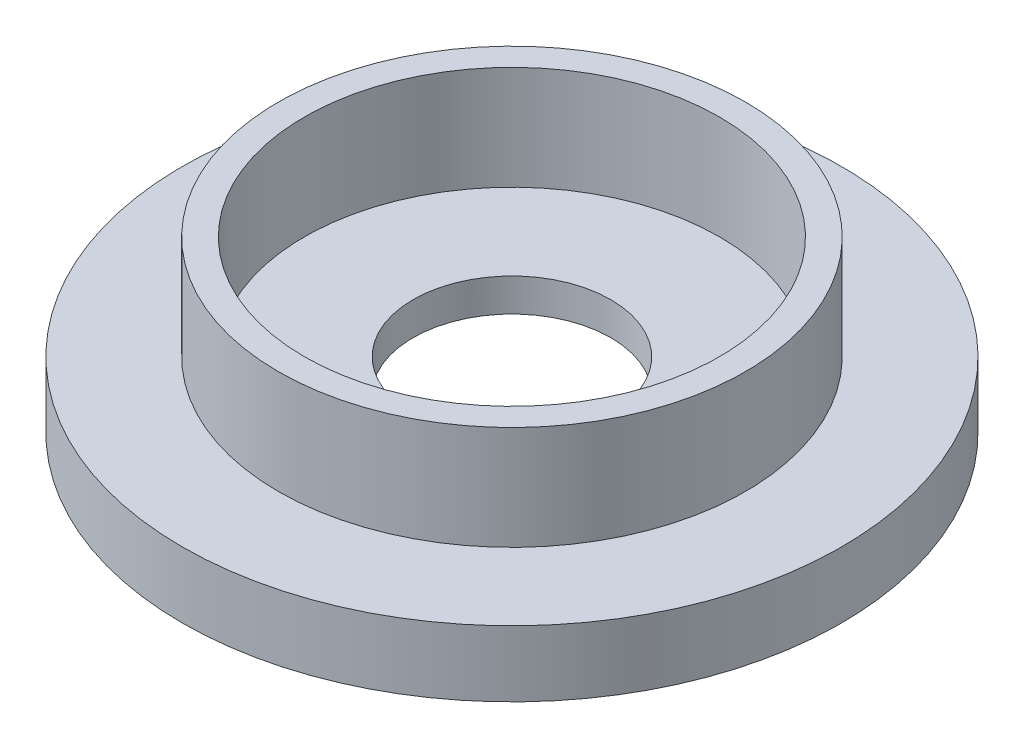
ISO-10303-21;
HEADER;
FILE_DESCRIPTION(('STEP AP214'),'2;1');
FILE_NAME('part.step','',(''),(''),'','','');
FILE_SCHEMA(('AUTOMOTIVE_DESIGN { 1 0 10303 214 1 1 1 1 }'));
ENDSEC;
DATA;
#1=APPLICATION_CONTEXT('core data for automotive mechanical design processes');
#2=APPLICATION_PROTOCOL_DEFINITION('international standard','automotive_design',2000,#1);
#3=PRODUCT_CONTEXT('',#1,'mechanical');
#4=PRODUCT('Part','Part','',(#3));
#5=PRODUCT_RELATED_PRODUCT_CATEGORY('part','',(#4));
#6=PRODUCT_DEFINITION_FORMATION('','',#4);
#7=PRODUCT_DEFINITION_CONTEXT('part definition',#1,'design');
#8=PRODUCT_DEFINITION('design','',#6,#7);
#9=PRODUCT_DEFINITION_SHAPE('','',#8);
#10=(LENGTH_UNIT() NAMED_UNIT(*) SI_UNIT(.MILLI.,.METRE.));
#11=(NAMED_UNIT(*) PLANE_ANGLE_UNIT() SI_UNIT($,.RADIAN.));
#12=(NAMED_UNIT(*) SI_UNIT($,.STERADIAN.) SOLID_ANGLE_UNIT());
#13=UNCERTAINTY_MEASURE_WITH_UNIT(LENGTH_MEASURE(1.E-05),#10,'distance_accuracy_value','');
#14=(GEOMETRIC_REPRESENTATION_CONTEXT(3) GLOBAL_UNCERTAINTY_ASSIGNED_CONTEXT((#13)) GLOBAL_UNIT_ASSIGNED_CONTEXT((#10,
#11,#12)) REPRESENTATION_CONTEXT('',''));
#15=CARTESIAN_POINT('',(0.,0.,0.));
#16=DIRECTION('',(0.,0.,1.));
#17=DIRECTION('',(1.,0.,0.));
#18=AXIS2_PLACEMENT_3D('',#15,#16,#17);
#19=CARTESIAN_POINT('',(0.,12.7,0.));
#20=DIRECTION('',(0.,1.,0.));
#21=DIRECTION('',(0.,0.,1.));
#22=AXIS2_PLACEMENT_3D('',#19,#20,#21);
#23=PLANE('',#22);
#24=CARTESIAN_POINT('',(0.,12.7,0.));
#25=DIRECTION('',(0.,1.,0.));
#26=DIRECTION('',(0.,0.,1.));
#27=AXIS2_PLACEMENT_3D('',#24,#25,#26);
#28=CIRCLE('',#27,19.05);
#29=CARTESIAN_POINT('',(0.,12.7,19.05));
#30=VERTEX_POINT('',#29);
#31=EDGE_CURVE('E61',#30,#30,#28,.T.);
#32=ORIENTED_EDGE('',*,*,#31,.F.);
#33=EDGE_LOOP('',(#32));
#34=FACE_BOUND('',#33,.T.);
#35=CARTESIAN_POINT('',(0.,12.7,0.));
#36=DIRECTION('',(0.,1.,0.));
#37=DIRECTION('',(0.,0.,1.));
#38=AXIS2_PLACEMENT_3D('',#35,#36,#37);
#39=CIRCLE('',#38,40.);
#40=CARTESIAN_POINT('',(0.,12.7,40.));
#41=VERTEX_POINT('',#40);
#42=EDGE_CURVE('E117',#41,#41,#39,.T.);
#43=ORIENTED_EDGE('',*,*,#42,.T.);
#44=EDGE_LOOP('',(#43));
#45=FACE_BOUND('',#44,.T.);
#46=ADVANCED_FACE('F36',(#34,#45),#23,.T.);
#47=CARTESIAN_POINT('',(0.,12.7,0.));
#48=DIRECTION('',(0.,-1.,0.));
#49=DIRECTION('',(0.,0.,-1.));
#50=AXIS2_PLACEMENT_3D('',#47,#48,#49);
#51=CYLINDRICAL_SURFACE('',#50,19.05);
#52=ORIENTED_EDGE('',*,*,#31,.T.);
#53=EDGE_LOOP('',(#52));
#54=FACE_BOUND('',#53,.T.);
#55=CARTESIAN_POINT('',(0.,6.35,0.));
#56=DIRECTION('',(0.,-1.,0.));
#57=DIRECTION('',(0.,0.,-1.));
#58=AXIS2_PLACEMENT_3D('',#55,#56,#57);
#59=CIRCLE('',#58,19.05);
#60=CARTESIAN_POINT('',(0.,6.35,-19.05));
#61=VERTEX_POINT('',#60);
#62=EDGE_CURVE('E40',#61,#61,#59,.T.);
#63=ORIENTED_EDGE('',*,*,#62,.T.);
#64=EDGE_LOOP('',(#63));
#65=FACE_BOUND('',#64,.T.);
#66=ADVANCED_FACE('F77',(#54,#65),#51,.F.);
#67=CARTESIAN_POINT('',(0.,12.7,0.));
#68=DIRECTION('',(0.,1.,0.));
#69=DIRECTION('',(0.,0.,1.));
#70=AXIS2_PLACEMENT_3D('',#67,#68,#69);
#71=CIRCLE('',#70,45.);
#72=CARTESIAN_POINT('',(0.,12.7,45.));
#73=VERTEX_POINT('',#72);
#74=EDGE_CURVE('E10',#73,#73,#71,.T.);
#75=ORIENTED_EDGE('',*,*,#74,.F.);
#76=EDGE_LOOP('',(#75));
#77=FACE_BOUND('',#76,.T.);
#78=CARTESIAN_POINT('',(0.,12.7,0.));
#79=DIRECTION('',(0.,1.,0.));
#80=DIRECTION('',(0.,0.,1.));
#81=AXIS2_PLACEMENT_3D('',#78,#79,#80);
#82=CIRCLE('',#81,63.5);
#83=CARTESIAN_POINT('',(0.,12.7,63.5));
#84=VERTEX_POINT('',#83);
#85=EDGE_CURVE('E44',#84,#84,#82,.T.);
#86=ORIENTED_EDGE('',*,*,#85,.T.);
#87=EDGE_LOOP('',(#86));
#88=FACE_BOUND('',#87,.T.);
#89=ADVANCED_FACE('F69',(#77,#88),#23,.T.);
#90=CARTESIAN_POINT('',(0.,0.,0.));
#91=DIRECTION('',(0.,1.,0.));
#92=DIRECTION('',(0.,0.,1.));
#93=AXIS2_PLACEMENT_3D('',#90,#91,#92);
#94=PLANE('',#93);
#95=CARTESIAN_POINT('',(0.,0.,0.));
#96=DIRECTION('',(0.,-1.,0.));
#97=DIRECTION('',(0.,0.,-1.));
#98=AXIS2_PLACEMENT_3D('',#95,#96,#97);
#99=CIRCLE('',#98,57.15);
#100=CARTESIAN_POINT('',(0.,0.,-57.15));
#101=VERTEX_POINT('',#100);
#102=EDGE_CURVE('E58',#101,#101,#99,.T.);
#103=ORIENTED_EDGE('',*,*,#102,.F.);
#104=EDGE_LOOP('',(#103));
#105=FACE_BOUND('',#104,.T.);
#106=CARTESIAN_POINT('',(0.,0.,0.));
#107=DIRECTION('',(0.,1.,0.));
#108=DIRECTION('',(0.,0.,1.));
#109=AXIS2_PLACEMENT_3D('',#106,#107,#108);
#110=CIRCLE('',#109,63.5);
#111=CARTESIAN_POINT('',(0.,0.,63.5));
#112=VERTEX_POINT('',#111);
#113=EDGE_CURVE('E49',#112,#112,#110,.T.);
#114=ORIENTED_EDGE('',*,*,#113,.F.);
#115=EDGE_LOOP('',(#114));
#116=FACE_BOUND('',#115,.T.);
#117=ADVANCED_FACE('F67',(#105,#116),#94,.F.);
#118=CARTESIAN_POINT('',(0.,12.7,0.));
#119=DIRECTION('',(0.,-1.,0.));
#120=DIRECTION('',(0.,0.,-1.));
#121=AXIS2_PLACEMENT_3D('',#118,#119,#120);
#122=CYLINDRICAL_SURFACE('',#121,63.5);
#123=ORIENTED_EDGE('',*,*,#85,.F.);
#124=EDGE_LOOP('',(#123));
#125=FACE_BOUND('',#124,.T.);
#126=ORIENTED_EDGE('',*,*,#113,.T.);
#127=EDGE_LOOP('',(#126));
#128=FACE_BOUND('',#127,.T.);
#129=ADVANCED_FACE('F38',(#125,#128),#122,.T.);
#130=CARTESIAN_POINT('',(0.,6.35,0.));
#131=DIRECTION('',(0.,-1.,0.));
#132=DIRECTION('',(0.,0.,-1.));
#133=AXIS2_PLACEMENT_3D('',#130,#131,#132);
#134=CYLINDRICAL_SURFACE('',#133,57.15);
#135=CARTESIAN_POINT('',(0.,6.35,0.));
#136=DIRECTION('',(0.,-1.,0.));
#137=DIRECTION('',(0.,0.,-1.));
#138=AXIS2_PLACEMENT_3D('',#135,#136,#137);
#139=CIRCLE('',#138,57.15);
#140=CARTESIAN_POINT('',(0.,6.35,-57.15));
#141=VERTEX_POINT('',#140);
#142=EDGE_CURVE('E55',#141,#141,#139,.T.);
#143=ORIENTED_EDGE('',*,*,#142,.F.);
#144=EDGE_LOOP('',(#143));
#145=FACE_BOUND('',#144,.T.);
#146=ORIENTED_EDGE('',*,*,#102,.T.);
#147=EDGE_LOOP('',(#146));
#148=FACE_BOUND('',#147,.T.);
#149=ADVANCED_FACE('F75',(#145,#148),#134,.F.);
#150=CARTESIAN_POINT('',(0.,6.35,0.));
#151=DIRECTION('',(0.,-1.,0.));
#152=DIRECTION('',(0.,0.,-1.));
#153=AXIS2_PLACEMENT_3D('',#150,#151,#152);
#154=PLANE('',#153);
#155=ORIENTED_EDGE('',*,*,#62,.F.);
#156=EDGE_LOOP('',(#155));
#157=FACE_BOUND('',#156,.T.);
#158=ORIENTED_EDGE('',*,*,#142,.T.);
#159=EDGE_LOOP('',(#158));
#160=FACE_BOUND('',#159,.T.);
#161=ADVANCED_FACE('F93',(#157,#160),#154,.T.);
#162=CARTESIAN_POINT('',(0.,32.7,0.));
#163=DIRECTION('',(0.,1.,0.));
#164=DIRECTION('',(0.,0.,1.));
#165=AXIS2_PLACEMENT_3D('',#162,#163,#164);
#166=PLANE('',#165);
#167=CARTESIAN_POINT('',(0.,32.7,0.));
#168=DIRECTION('',(0.,1.,0.));
#169=DIRECTION('',(0.,0.,1.));
#170=AXIS2_PLACEMENT_3D('',#167,#168,#169);
#171=CIRCLE('',#170,45.);
#172=CARTESIAN_POINT('',(0.,32.7,45.));
#173=VERTEX_POINT('',#172);
#174=EDGE_CURVE('E53',#173,#173,#171,.T.);
#175=ORIENTED_EDGE('',*,*,#174,.T.);
#176=EDGE_LOOP('',(#175));
#177=FACE_BOUND('',#176,.T.);
#178=CARTESIAN_POINT('',(0.,32.7,0.));
#179=DIRECTION('',(0.,1.,0.));
#180=DIRECTION('',(0.,0.,1.));
#181=AXIS2_PLACEMENT_3D('',#178,#179,#180);
#182=CIRCLE('',#181,40.);
#183=CARTESIAN_POINT('',(0.,32.7,40.));
#184=VERTEX_POINT('',#183);
#185=EDGE_CURVE('E114',#184,#184,#182,.T.);
#186=ORIENTED_EDGE('',*,*,#185,.F.);
#187=EDGE_LOOP('',(#186));
#188=FACE_BOUND('',#187,.T.);
#189=ADVANCED_FACE('F97',(#177,#188),#166,.T.);
#190=CARTESIAN_POINT('',(0.,32.7,0.));
#191=DIRECTION('',(0.,-1.,0.));
#192=DIRECTION('',(0.,0.,-1.));
#193=AXIS2_PLACEMENT_3D('',#190,#191,#192);
#194=CYLINDRICAL_SURFACE('',#193,45.);
#195=ORIENTED_EDGE('',*,*,#174,.F.);
#196=EDGE_LOOP('',(#195));
#197=FACE_BOUND('',#196,.T.);
#198=ORIENTED_EDGE('',*,*,#74,.T.);
#199=EDGE_LOOP('',(#198));
#200=FACE_BOUND('',#199,.T.);
#201=ADVANCED_FACE('F99',(#197,#200),#194,.T.);
#202=CARTESIAN_POINT('',(0.,32.7,0.));
#203=DIRECTION('',(0.,-1.,0.));
#204=DIRECTION('',(0.,0.,-1.));
#205=AXIS2_PLACEMENT_3D('',#202,#203,#204);
#206=CYLINDRICAL_SURFACE('',#205,40.);
#207=ORIENTED_EDGE('',*,*,#185,.T.);
#208=EDGE_LOOP('',(#207));
#209=FACE_BOUND('',#208,.T.);
#210=ORIENTED_EDGE('',*,*,#42,.F.);
#211=EDGE_LOOP('',(#210));
#212=FACE_BOUND('',#211,.T.);
#213=ADVANCED_FACE('F102',(#209,#212),#206,.F.);
#214=CLOSED_SHELL('',(#46,#66,#89,#117,#129,#149,#161,#189,#201,#213));
#215=MANIFOLD_SOLID_BREP('B2',#214);
#216=ADVANCED_BREP_SHAPE_REPRESENTATION('',(#18,#215),#14);
#217=SHAPE_DEFINITION_REPRESENTATION(#9,#216);
ENDSEC;
END-ISO-10303-21;
